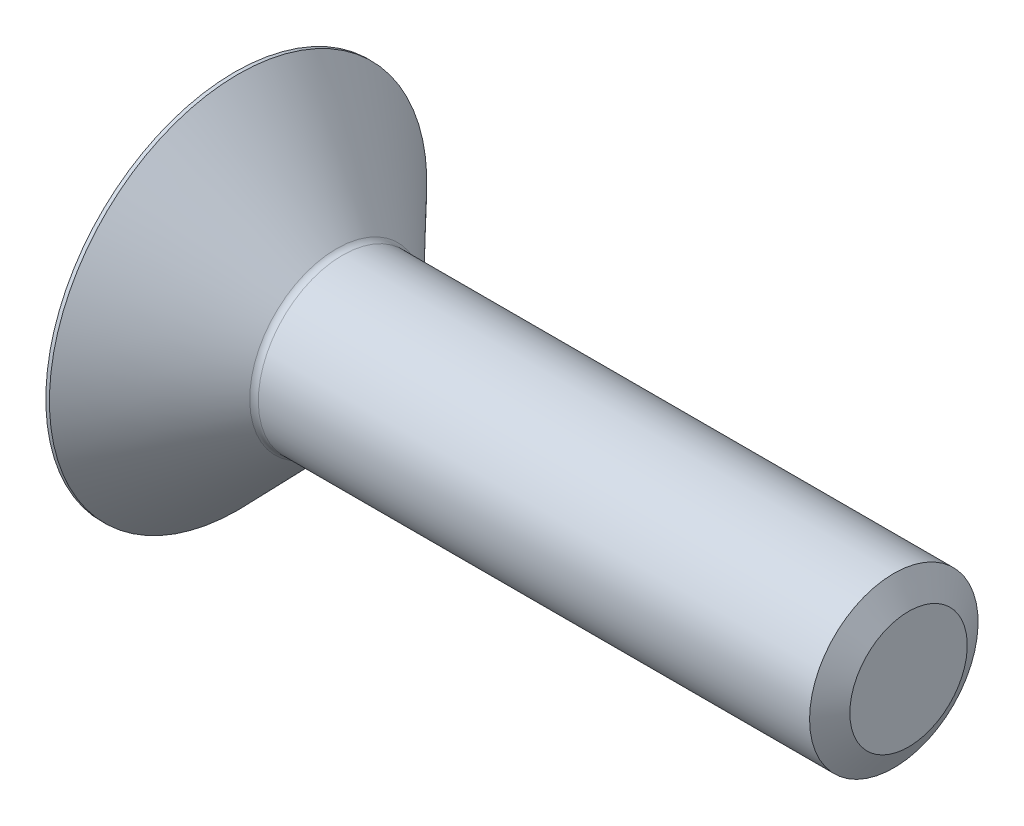
ISO-10303-21;
HEADER;
FILE_DESCRIPTION(('STEP AP214'),'2;1');
FILE_NAME('part.step','',(''),(''),'','','');
FILE_SCHEMA(('AUTOMOTIVE_DESIGN { 1 0 10303 214 1 1 1 1 }'));
ENDSEC;
DATA;
#1=APPLICATION_CONTEXT('core data for automotive mechanical design processes');
#2=APPLICATION_PROTOCOL_DEFINITION('international standard','automotive_design',2000,#1);
#3=PRODUCT_CONTEXT('',#1,'mechanical');
#4=PRODUCT('Part','Part','',(#3));
#5=PRODUCT_RELATED_PRODUCT_CATEGORY('part','',(#4));
#6=PRODUCT_DEFINITION_FORMATION('','',#4);
#7=PRODUCT_DEFINITION_CONTEXT('part definition',#1,'design');
#8=PRODUCT_DEFINITION('design','',#6,#7);
#9=PRODUCT_DEFINITION_SHAPE('','',#8);
#10=(LENGTH_UNIT() NAMED_UNIT(*) SI_UNIT(.MILLI.,.METRE.));
#11=(NAMED_UNIT(*) PLANE_ANGLE_UNIT() SI_UNIT($,.RADIAN.));
#12=(NAMED_UNIT(*) SI_UNIT($,.STERADIAN.) SOLID_ANGLE_UNIT());
#13=UNCERTAINTY_MEASURE_WITH_UNIT(LENGTH_MEASURE(1.E-05),#10,'distance_accuracy_value','');
#14=(GEOMETRIC_REPRESENTATION_CONTEXT(3) GLOBAL_UNCERTAINTY_ASSIGNED_CONTEXT((#13)) GLOBAL_UNIT_ASSIGNED_CONTEXT((#10,
#11,#12)) REPRESENTATION_CONTEXT('',''));
#15=CARTESIAN_POINT('',(0.,0.,0.));
#16=DIRECTION('',(0.,0.,1.));
#17=DIRECTION('',(1.,0.,0.));
#18=AXIS2_PLACEMENT_3D('',#15,#16,#17);
#19=CARTESIAN_POINT('',(0.,0.,0.));
#20=DIRECTION('',(1.,0.,0.));
#21=DIRECTION('',(0.,1.,0.));
#22=AXIS2_PLACEMENT_3D('',#19,#20,#21);
#23=CYLINDRICAL_SURFACE('',#22,2.);
#24=CARTESIAN_POINT('',(-13.4351050367581,0.,0.));
#25=DIRECTION('',(1.,0.,0.));
#26=DIRECTION('',(0.,1.,0.));
#27=AXIS2_PLACEMENT_3D('',#24,#25,#26);
#28=CIRCLE('',#27,2.);
#29=CARTESIAN_POINT('',(-13.4351050367581,2.,0.));
#30=VERTEX_POINT('',#29);
#31=EDGE_CURVE('E127',#30,#30,#28,.T.);
#32=ORIENTED_EDGE('',*,*,#31,.T.);
#33=EDGE_LOOP('',(#32));
#34=FACE_BOUND('',#33,.T.);
#35=CARTESIAN_POINT('',(-0.349999999999999,0.,0.));
#36=DIRECTION('',(-1.,0.,0.));
#37=DIRECTION('',(0.,0.,1.));
#38=AXIS2_PLACEMENT_3D('',#35,#36,#37);
#39=CIRCLE('',#38,2.);
#40=CARTESIAN_POINT('',(-0.349999999999999,0.,2.));
#41=VERTEX_POINT('',#40);
#42=EDGE_CURVE('E314',#41,#41,#39,.T.);
#43=ORIENTED_EDGE('',*,*,#42,.T.);
#44=EDGE_LOOP('',(#43));
#45=FACE_BOUND('',#44,.T.);
#46=ADVANCED_FACE('F40',(#34,#45),#23,.T.);
#47=CARTESIAN_POINT('',(-16.,4.48,0.));
#48=DIRECTION('',(-1.,0.,0.));
#49=DIRECTION('',(0.,-1.,0.));
#50=AXIS2_PLACEMENT_3D('',#47,#48,#49);
#51=PLANE('',#50);
#52=CARTESIAN_POINT('',(-16.,0.,0.));
#53=DIRECTION('',(1.,0.,0.));
#54=DIRECTION('',(0.,1.,0.));
#55=AXIS2_PLACEMENT_3D('',#52,#53,#54);
#56=CIRCLE('',#55,4.48);
#57=CARTESIAN_POINT('',(-16.,4.48,0.));
#58=VERTEX_POINT('',#57);
#59=EDGE_CURVE('E216',#58,#58,#56,.T.);
#60=ORIENTED_EDGE('',*,*,#59,.F.);
#61=EDGE_LOOP('',(#60));
#62=FACE_BOUND('',#61,.T.);
#63=CARTESIAN_POINT('',(-16.,0.,0.));
#64=DIRECTION('',(-1.,0.,0.));
#65=DIRECTION('',(0.,-1.,0.));
#66=AXIS2_PLACEMENT_3D('',#63,#64,#65);
#67=CIRCLE('',#66,1.44337567297406);
#68=CARTESIAN_POINT('',(-16.,-0.72168783648704,1.24999999999999));
#69=VERTEX_POINT('',#68);
#70=CARTESIAN_POINT('',(-16.,-1.44337567297406,0.));
#71=VERTEX_POINT('',#70);
#72=EDGE_CURVE('E44',#69,#71,#67,.F.);
#73=ORIENTED_EDGE('',*,*,#72,.T.);
#74=CARTESIAN_POINT('',(-16.,-0.72168783648704,-1.24999999999999));
#75=VERTEX_POINT('',#74);
#76=EDGE_CURVE('E11',#71,#75,#67,.F.);
#77=ORIENTED_EDGE('',*,*,#76,.T.);
#78=CARTESIAN_POINT('',(-16.,0.72168783648703,-1.25));
#79=VERTEX_POINT('',#78);
#80=EDGE_CURVE('E49',#75,#79,#67,.F.);
#81=ORIENTED_EDGE('',*,*,#80,.T.);
#82=CARTESIAN_POINT('',(-16.,1.44337567297406,0.));
#83=VERTEX_POINT('',#82);
#84=EDGE_CURVE('E114',#79,#83,#67,.F.);
#85=ORIENTED_EDGE('',*,*,#84,.T.);
#86=CARTESIAN_POINT('',(-16.,0.,0.));
#87=DIRECTION('',(-1.,0.,0.));
#88=DIRECTION('',(0.,0.,1.));
#89=AXIS2_PLACEMENT_3D('',#86,#87,#88);
#90=CIRCLE('',#89,1.44337567297406);
#91=CARTESIAN_POINT('',(-16.,0.721687836487035,1.25));
#92=VERTEX_POINT('',#91);
#93=EDGE_CURVE('E99',#92,#83,#90,.T.);
#94=ORIENTED_EDGE('',*,*,#93,.F.);
#95=EDGE_CURVE('E108',#92,#69,#67,.F.);
#96=ORIENTED_EDGE('',*,*,#95,.T.);
#97=EDGE_LOOP('',(#73,#77,#81,#85,#94,#96));
#98=FACE_BOUND('',#97,.T.);
#99=ADVANCED_FACE('F115',(#62,#98),#51,.T.);
#100=CARTESIAN_POINT('',(0.,0.,0.));
#101=DIRECTION('',(1.,0.,0.));
#102=DIRECTION('',(0.,1.,0.));
#103=AXIS2_PLACEMENT_3D('',#100,#101,#102);
#104=CYLINDRICAL_SURFACE('',#103,4.48);
#105=ORIENTED_EDGE('',*,*,#59,.T.);
#106=EDGE_LOOP('',(#105));
#107=FACE_BOUND('',#106,.T.);
#108=CARTESIAN_POINT('',(-15.9149081615215,0.,0.));
#109=DIRECTION('',(1.,0.,0.));
#110=DIRECTION('',(0.,1.,0.));
#111=AXIS2_PLACEMENT_3D('',#108,#109,#110);
#112=CIRCLE('',#111,4.48);
#113=CARTESIAN_POINT('',(-15.9149081615215,4.48,0.));
#114=VERTEX_POINT('',#113);
#115=EDGE_CURVE('E218',#114,#114,#112,.T.);
#116=ORIENTED_EDGE('',*,*,#115,.F.);
#117=EDGE_LOOP('',(#116));
#118=FACE_BOUND('',#117,.T.);
#119=ADVANCED_FACE('F206',(#107,#118),#104,.T.);
#120=CARTESIAN_POINT('',(-13.5789729968258,0.,0.));
#121=DIRECTION('',(-1.,0.,0.));
#122=DIRECTION('',(0.,-1.,0.));
#123=AXIS2_PLACEMENT_3D('',#120,#121,#122);
#124=CONICAL_SURFACE('',#123,2.0610683259082,0.802851455917393);
#125=ORIENTED_EDGE('',*,*,#115,.T.);
#126=EDGE_LOOP('',(#125));
#127=FACE_BOUND('',#126,.T.);
#128=CARTESIAN_POINT('',(-13.5789729968258,0.,0.));
#129=DIRECTION('',(1.,0.,0.));
#130=DIRECTION('',(0.,1.,0.));
#131=AXIS2_PLACEMENT_3D('',#128,#129,#130);
#132=CIRCLE('',#131,2.0610683259082);
#133=CARTESIAN_POINT('',(-13.5789729968258,2.0610683259082,0.));
#134=VERTEX_POINT('',#133);
#135=EDGE_CURVE('E222',#134,#134,#132,.T.);
#136=ORIENTED_EDGE('',*,*,#135,.F.);
#137=EDGE_LOOP('',(#136));
#138=FACE_BOUND('',#137,.T.);
#139=ADVANCED_FACE('F202',(#127,#138),#124,.T.);
#140=CARTESIAN_POINT('',(-13.4351050367581,0.,0.));
#141=DIRECTION('',(1.,0.,0.));
#142=DIRECTION('',(0.,1.,0.));
#143=AXIS2_PLACEMENT_3D('',#140,#141,#142);
#144=TOROIDAL_SURFACE('',#143,2.2,0.200000000000001);
#145=ORIENTED_EDGE('',*,*,#135,.T.);
#146=EDGE_LOOP('',(#145));
#147=FACE_BOUND('',#146,.T.);
#148=ORIENTED_EDGE('',*,*,#31,.F.);
#149=EDGE_LOOP('',(#148));
#150=FACE_BOUND('',#149,.T.);
#151=ADVANCED_FACE('F198',(#147,#150),#144,.F.);
#152=CARTESIAN_POINT('',(-15.593,0.,0.));
#153=DIRECTION('',(-1.,0.,0.));
#154=DIRECTION('',(0.,0.,1.));
#155=AXIS2_PLACEMENT_3D('',#152,#153,#154);
#156=CONICAL_SURFACE('',#155,0.,1.29595448752628);
#157=CARTESIAN_POINT('',(-16.0000325639069,-0.721572366433197,1.2502));
#158=CARTESIAN_POINT('',(-15.991576864719,-0.751541131585369,1.19829257611634));
#159=CARTESIAN_POINT('',(-15.9838983725877,-0.781569978777702,1.1462810870865));
#160=CARTESIAN_POINT('',(-15.9704054515754,-0.841745134078228,1.04205466075264));
#161=CARTESIAN_POINT('',(-15.964591866691,-0.871891489137524,0.989839642126926));
#162=CARTESIAN_POINT('',(-15.9551735985119,-0.932099362057424,0.885556547214008));
#163=CARTESIAN_POINT('',(-15.9515564854096,-0.962160380653127,0.833489335678977));
#164=CARTESIAN_POINT('',(-15.9467061131036,-1.02232485811963,0.729281403896156));
#165=CARTESIAN_POINT('',(-15.9454723393403,-1.05242830642509,0.677140701948078));
#166=CARTESIAN_POINT('',(-15.9454723393403,-1.11263520303601,0.572859298051922));
#167=CARTESIAN_POINT('',(-15.9467061131036,-1.14273865134147,0.520718596103843));
#168=CARTESIAN_POINT('',(-15.9515564854096,-1.20290312880797,0.416510664321023));
#169=CARTESIAN_POINT('',(-15.9551735985119,-1.23296414740368,0.364443452785991));
#170=CARTESIAN_POINT('',(-15.964591866691,-1.29317202032358,0.260160357873074));
#171=CARTESIAN_POINT('',(-15.9704054515754,-1.32331837538287,0.207945339247364));
#172=CARTESIAN_POINT('',(-15.9838983725877,-1.3834935306834,0.103718912913505));
#173=CARTESIAN_POINT('',(-15.991576864719,-1.41352237787573,0.0517074238836614));
#174=CARTESIAN_POINT('',(-16.0000325639069,-1.4434911430279,-0.000199999999999701));
#175=B_SPLINE_CURVE_WITH_KNOTS('',3,(#157,#158,#159,#160,#161,#162,#163,#164,#165,#166,#167,
#168,#169,#170,#171,#172,#173,#174),.UNSPECIFIED.,.F.,.F.,(4,2,2,2,2,2,2,2,4),(0.,
0.18160374958483,0.36328957156208,0.543937414070992,0.72454625060746,0.905155087143927,
1.08580292965284,1.26748875163009,1.44909250121492),.UNSPECIFIED.);
#176=EDGE_CURVE('E133',#69,#71,#175,.T.);
#177=ORIENTED_EDGE('',*,*,#176,.T.);
#178=ORIENTED_EDGE('',*,*,#72,.F.);
#179=EDGE_LOOP('',(#177,#178));
#180=FACE_BOUND('',#179,.T.);
#181=ADVANCED_FACE('F201',(#180),#156,.F.);
#182=CARTESIAN_POINT('',(-16.230054854727,-1.88192774876372,1.25));
#183=CARTESIAN_POINT('',(-16.2168061816408,-1.8255137400607,1.25));
#184=CARTESIAN_POINT('',(-16.2037258112081,-1.76906017891574,1.25));
#185=CARTESIAN_POINT('',(-16.1779869751788,-1.65605409957583,1.25));
#186=CARTESIAN_POINT('',(-16.1653285307257,-1.59950157657073,1.25));
#187=CARTESIAN_POINT('',(-16.1280879422272,-1.42954612490577,1.25));
#188=CARTESIAN_POINT('',(-16.1042709227473,-1.31597293305458,1.25));
#189=CARTESIAN_POINT('',(-16.0599692539508,-1.08931538105831,1.25));
#190=CARTESIAN_POINT('',(-16.0394543826368,-0.976237048644354,1.25));
#191=CARTESIAN_POINT('',(-16.0031083621366,-0.749332532153091,1.25));
#192=CARTESIAN_POINT('',(-15.9872761488083,-0.635506524005941,1.25));
#193=CARTESIAN_POINT('',(-15.9623551261036,-0.405617067524412,1.25));
#194=CARTESIAN_POINT('',(-15.9533532269162,-0.289543448802649,1.25));
#195=CARTESIAN_POINT('',(-15.9465899221525,-0.115205222838837,1.25));
#196=CARTESIAN_POINT('',(-15.9454583626773,-0.0570644643245798,1.25));
#197=CARTESIAN_POINT('',(-15.9454865772141,0.0592166170352015,1.25));
#198=CARTESIAN_POINT('',(-15.9466463560642,0.117356939879547,1.25));
#199=CARTESIAN_POINT('',(-15.9535104843876,0.292169226773828,1.25));
#200=CARTESIAN_POINT('',(-15.9626193191916,0.408714396179601,1.25));
#201=CARTESIAN_POINT('',(-15.987953181016,0.64106205157089,1.25));
#202=CARTESIAN_POINT('',(-16.0041839479739,0.756863861904299,1.25));
#203=CARTESIAN_POINT('',(-16.0420513932587,0.991534965339215,1.25));
#204=CARTESIAN_POINT('',(-16.063850897622,1.11037712244683,1.25));
#205=CARTESIAN_POINT('',(-16.1107131319875,1.34742332227276,1.25));
#206=CARTESIAN_POINT('',(-16.1357764440616,1.46562724724241,1.25));
#207=CARTESIAN_POINT('',(-16.1880082919745,1.70160185265613,1.25));
#208=CARTESIAN_POINT('',(-16.2151774684754,1.81937238974697,1.25));
#209=CARTESIAN_POINT('',(-16.2709069397528,2.05458449010658,1.25));
#210=CARTESIAN_POINT('',(-16.2994672676032,2.17202604548372,1.25));
#211=CARTESIAN_POINT('',(-16.3571404984079,2.40505512634129,1.25));
#212=CARTESIAN_POINT('',(-16.3862403573857,2.52064589314675,1.25));
#213=CARTESIAN_POINT('',(-16.4451006119577,2.7516618269686,1.25));
#214=CARTESIAN_POINT('',(-16.4748610242592,2.86708698971762,1.25));
#215=CARTESIAN_POINT('',(-16.534817355156,3.09763737586545,1.25));
#216=CARTESIAN_POINT('',(-16.5650125463553,3.21276278881204,1.25));
#217=CARTESIAN_POINT('',(-16.6257689948511,3.44291215791421,1.25));
#218=CARTESIAN_POINT('',(-16.656330237577,3.55793611791373,1.25));
#219=CARTESIAN_POINT('',(-16.687019012393,3.67292565898518,1.25));
#220=B_SPLINE_CURVE_WITH_KNOTS('',3,(#182,#183,#184,#185,#186,#187,#188,#189,#190,#191,#192,
#193,#194,#195,#196,#197,#198,#199,#200,#201,#202,#203,#204,#205,#206,#207,#208,#209,#210,#211,
#212,#213,#214,#215,#216,#217,#218,#219),.UNSPECIFIED.,.F.,.F.,(4,2,2,2,2,2,2,2,2,2,2,2,2,2,2,2,
2,2,4),(0.,0.173845962501761,0.347700623700958,0.695803457931749,1.04051283645618,
1.38514381887278,1.73408963262349,1.90850297063879,2.08291667692807,2.43329501130733,
2.78395625407464,3.14636001893445,3.50882850410612,3.87140769831936,4.2339955168655,
4.59158519290897,4.94918392371833,5.30624137064038,5.66328465178794),.UNSPECIFIED.);
#221=EDGE_CURVE('E104',#92,#69,#220,.F.);
#222=ORIENTED_EDGE('',*,*,#221,.T.);
#223=ORIENTED_EDGE('',*,*,#95,.F.);
#224=EDGE_LOOP('',(#222,#223));
#225=FACE_BOUND('',#224,.T.);
#226=ADVANCED_FACE('F109',(#225),#156,.F.);
#227=CARTESIAN_POINT('',(-16.0000325639069,1.4434911430279,-0.000200000000000113));
#228=CARTESIAN_POINT('',(-15.991576864719,1.41352237787573,0.0517074238836605));
#229=CARTESIAN_POINT('',(-15.9838983725877,1.3834935306834,0.103718912913504));
#230=CARTESIAN_POINT('',(-15.9704054515754,1.32331837538287,0.207945339247363));
#231=CARTESIAN_POINT('',(-15.964591866691,1.29317202032357,0.260160357873074));
#232=CARTESIAN_POINT('',(-15.9551735985119,1.23296414740367,0.364443452785991));
#233=CARTESIAN_POINT('',(-15.9515564854096,1.20290312880797,0.416510664321023));
#234=CARTESIAN_POINT('',(-15.9467061131036,1.14273865134146,0.520718596103843));
#235=CARTESIAN_POINT('',(-15.9454723393403,1.11263520303601,0.572859298051922));
#236=CARTESIAN_POINT('',(-15.9454723393403,1.05242830642509,0.677140701948078));
#237=CARTESIAN_POINT('',(-15.9467061131036,1.02232485811963,0.729281403896156));
#238=CARTESIAN_POINT('',(-15.9515564854096,0.962160380653123,0.833489335678976));
#239=CARTESIAN_POINT('',(-15.9551735985119,0.932099362057419,0.885556547214008));
#240=CARTESIAN_POINT('',(-15.964591866691,0.871891489137519,0.989839642126926));
#241=CARTESIAN_POINT('',(-15.9704054515754,0.841745134078223,1.04205466075264));
#242=CARTESIAN_POINT('',(-15.9838983725877,0.781569978777697,1.1462810870865));
#243=CARTESIAN_POINT('',(-15.991576864719,0.751541131585364,1.19829257611634));
#244=CARTESIAN_POINT('',(-16.0000325639069,0.721572366433193,1.2502));
#245=B_SPLINE_CURVE_WITH_KNOTS('',3,(#227,#228,#229,#230,#231,#232,#233,#234,#235,#236,#237,
#238,#239,#240,#241,#242,#243,#244),.UNSPECIFIED.,.F.,.F.,(4,2,2,2,2,2,2,2,4),(0.,
0.18160374958483,0.36328957156208,0.543937414070993,0.72454625060746,0.905155087143927,
1.08580292965284,1.26748875163009,1.44909250121492),.UNSPECIFIED.);
#246=EDGE_CURVE('E95',#83,#92,#245,.T.);
#247=ORIENTED_EDGE('',*,*,#246,.T.);
#248=ORIENTED_EDGE('',*,*,#93,.T.);
#249=EDGE_LOOP('',(#247,#248));
#250=FACE_BOUND('',#249,.T.);
#251=ADVANCED_FACE('F97',(#250),#156,.F.);
#252=CARTESIAN_POINT('',(-16.0000325639069,0.721572366433192,-1.2502));
#253=CARTESIAN_POINT('',(-15.991576864719,0.751541131585364,-1.19829257611634));
#254=CARTESIAN_POINT('',(-15.9838983725877,0.781569978777697,-1.1462810870865));
#255=CARTESIAN_POINT('',(-15.9704054515754,0.841745134078223,-1.04205466075264));
#256=CARTESIAN_POINT('',(-15.964591866691,0.871891489137519,-0.989839642126926));
#257=CARTESIAN_POINT('',(-15.9551735985119,0.932099362057419,-0.885556547214009));
#258=CARTESIAN_POINT('',(-15.9515564854096,0.962160380653123,-0.833489335678977));
#259=CARTESIAN_POINT('',(-15.9467061131036,1.02232485811963,-0.729281403896157));
#260=CARTESIAN_POINT('',(-15.9454723393403,1.05242830642509,-0.677140701948078));
#261=CARTESIAN_POINT('',(-15.9454723393403,1.11263520303601,-0.572859298051922));
#262=CARTESIAN_POINT('',(-15.9467061131036,1.14273865134146,-0.520718596103844));
#263=CARTESIAN_POINT('',(-15.9515564854096,1.20290312880797,-0.416510664321023));
#264=CARTESIAN_POINT('',(-15.9551735985119,1.23296414740367,-0.364443452785991));
#265=CARTESIAN_POINT('',(-15.964591866691,1.29317202032357,-0.260160357873074));
#266=CARTESIAN_POINT('',(-15.9704054515754,1.32331837538287,-0.207945339247364));
#267=CARTESIAN_POINT('',(-15.9838983725877,1.3834935306834,-0.103718912913505));
#268=CARTESIAN_POINT('',(-15.991576864719,1.41352237787573,-0.0517074238836612));
#269=CARTESIAN_POINT('',(-16.0000325639069,1.4434911430279,0.000199999999999882));
#270=B_SPLINE_CURVE_WITH_KNOTS('',3,(#252,#253,#254,#255,#256,#257,#258,#259,#260,#261,#262,
#263,#264,#265,#266,#267,#268,#269),.UNSPECIFIED.,.F.,.F.,(4,2,2,2,2,2,2,2,4),(0.,
0.18160374958483,0.36328957156208,0.543937414070993,0.72454625060746,0.905155087143928,
1.08580292965284,1.26748875163009,1.44909250121492),.UNSPECIFIED.);
#271=EDGE_CURVE('E117',#79,#83,#270,.T.);
#272=ORIENTED_EDGE('',*,*,#271,.T.);
#273=ORIENTED_EDGE('',*,*,#84,.F.);
#274=EDGE_LOOP('',(#272,#273));
#275=FACE_BOUND('',#274,.T.);
#276=ADVANCED_FACE('F297',(#275),#156,.F.);
#277=CARTESIAN_POINT('',(-16.230054854727,-1.88192774876372,-1.25));
#278=CARTESIAN_POINT('',(-16.2168061816408,-1.8255137400607,-1.25));
#279=CARTESIAN_POINT('',(-16.2037258112081,-1.76906017891574,-1.25));
#280=CARTESIAN_POINT('',(-16.1779869751788,-1.65605409957583,-1.25));
#281=CARTESIAN_POINT('',(-16.1653285307257,-1.59950157657073,-1.25));
#282=CARTESIAN_POINT('',(-16.1280879422272,-1.42954612490577,-1.25));
#283=CARTESIAN_POINT('',(-16.1042709227473,-1.31597293305458,-1.25));
#284=CARTESIAN_POINT('',(-16.0599692539508,-1.08931538105831,-1.25));
#285=CARTESIAN_POINT('',(-16.0394543826368,-0.976237048644354,-1.25));
#286=CARTESIAN_POINT('',(-16.0031083621366,-0.74933253215309,-1.25));
#287=CARTESIAN_POINT('',(-15.9872761488083,-0.635506524005941,-1.25));
#288=CARTESIAN_POINT('',(-15.9623551261036,-0.405617067524411,-1.25));
#289=CARTESIAN_POINT('',(-15.9533532269162,-0.289543448802648,-1.25));
#290=CARTESIAN_POINT('',(-15.9465899221525,-0.115205222838836,-1.25));
#291=CARTESIAN_POINT('',(-15.9454583626773,-0.0570644643245787,-1.25));
#292=CARTESIAN_POINT('',(-15.9454865772141,0.0592166170352027,-1.25));
#293=CARTESIAN_POINT('',(-15.9466463560642,0.117356939879548,-1.25));
#294=CARTESIAN_POINT('',(-15.9535104843876,0.292169226773829,-1.25));
#295=CARTESIAN_POINT('',(-15.9626193191916,0.408714396179602,-1.25));
#296=CARTESIAN_POINT('',(-15.987953181016,0.641062051570891,-1.25));
#297=CARTESIAN_POINT('',(-16.0041839479739,0.7568638619043,-1.25));
#298=CARTESIAN_POINT('',(-16.0420513932587,0.991534965339216,-1.25));
#299=CARTESIAN_POINT('',(-16.063850897622,1.11037712244683,-1.25));
#300=CARTESIAN_POINT('',(-16.1107131319875,1.34742332227276,-1.25));
#301=CARTESIAN_POINT('',(-16.1357764440616,1.46562724724241,-1.25));
#302=CARTESIAN_POINT('',(-16.1880082919745,1.70160185265613,-1.25));
#303=CARTESIAN_POINT('',(-16.2151774684754,1.81937238974697,-1.25));
#304=CARTESIAN_POINT('',(-16.2709069397528,2.05458449010658,-1.25));
#305=CARTESIAN_POINT('',(-16.2994672676032,2.17202604548372,-1.25));
#306=CARTESIAN_POINT('',(-16.3571404984079,2.40505512634129,-1.25));
#307=CARTESIAN_POINT('',(-16.3862403573857,2.52064589314675,-1.25));
#308=CARTESIAN_POINT('',(-16.4451006119577,2.7516618269686,-1.25));
#309=CARTESIAN_POINT('',(-16.4748610242592,2.86708698971762,-1.25));
#310=CARTESIAN_POINT('',(-16.534817355156,3.09763737586545,-1.25));
#311=CARTESIAN_POINT('',(-16.5650125463553,3.21276278881204,-1.25));
#312=CARTESIAN_POINT('',(-16.6257689948511,3.44291215791421,-1.25));
#313=CARTESIAN_POINT('',(-16.656330237577,3.55793611791373,-1.25));
#314=CARTESIAN_POINT('',(-16.687019012393,3.67292565898518,-1.25));
#315=B_SPLINE_CURVE_WITH_KNOTS('',3,(#277,#278,#279,#280,#281,#282,#283,#284,#285,#286,#287,
#288,#289,#290,#291,#292,#293,#294,#295,#296,#297,#298,#299,#300,#301,#302,#303,#304,#305,#306,
#307,#308,#309,#310,#311,#312,#313,#314),.UNSPECIFIED.,.F.,.F.,(4,2,2,2,2,2,2,2,2,2,2,2,2,2,2,2,
2,2,4),(0.,0.17384596250176,0.347700623700958,0.695803457931749,1.04051283645618,
1.38514381887278,1.73408963262349,1.90850297063879,2.08291667692807,2.43329501130733,
2.78395625407464,3.14636001893446,3.50882850410612,3.87140769831936,4.2339955168655,
4.59158519290896,4.94918392371833,5.30624137064038,5.66328465178794),.UNSPECIFIED.);
#316=EDGE_CURVE('E252',#75,#79,#315,.T.);
#317=ORIENTED_EDGE('',*,*,#316,.T.);
#318=ORIENTED_EDGE('',*,*,#80,.F.);
#319=EDGE_LOOP('',(#317,#318));
#320=FACE_BOUND('',#319,.T.);
#321=ADVANCED_FACE('F284',(#320),#156,.F.);
#322=CARTESIAN_POINT('',(-16.0000325639069,-1.4434911430279,0.000199999999999665));
#323=CARTESIAN_POINT('',(-15.991576864719,-1.41352237787573,-0.0517074238836611));
#324=CARTESIAN_POINT('',(-15.9838983725877,-1.3834935306834,-0.103718912913504));
#325=CARTESIAN_POINT('',(-15.9704054515754,-1.32331837538287,-0.207945339247363));
#326=CARTESIAN_POINT('',(-15.964591866691,-1.29317202032358,-0.260160357873074));
#327=CARTESIAN_POINT('',(-15.9551735985119,-1.23296414740368,-0.364443452785991));
#328=CARTESIAN_POINT('',(-15.9515564854096,-1.20290312880797,-0.416510664321023));
#329=CARTESIAN_POINT('',(-15.9467061131036,-1.14273865134147,-0.520718596103844));
#330=CARTESIAN_POINT('',(-15.9454723393403,-1.11263520303601,-0.572859298051922));
#331=CARTESIAN_POINT('',(-15.9454723393403,-1.05242830642509,-0.677140701948078));
#332=CARTESIAN_POINT('',(-15.9467061131036,-1.02232485811963,-0.729281403896157));
#333=CARTESIAN_POINT('',(-15.9515564854096,-0.962160380653126,-0.833489335678977));
#334=CARTESIAN_POINT('',(-15.9551735985119,-0.932099362057423,-0.885556547214009));
#335=CARTESIAN_POINT('',(-15.964591866691,-0.871891489137523,-0.989839642126926));
#336=CARTESIAN_POINT('',(-15.9704054515754,-0.841745134078227,-1.04205466075264));
#337=CARTESIAN_POINT('',(-15.9838983725877,-0.781569978777701,-1.1462810870865));
#338=CARTESIAN_POINT('',(-15.991576864719,-0.751541131585368,-1.19829257611634));
#339=CARTESIAN_POINT('',(-16.0000325639069,-0.721572366433196,-1.2502));
#340=B_SPLINE_CURVE_WITH_KNOTS('',3,(#322,#323,#324,#325,#326,#327,#328,#329,#330,#331,#332,
#333,#334,#335,#336,#337,#338,#339),.UNSPECIFIED.,.F.,.F.,(4,2,2,2,2,2,2,2,4),(0.,
0.18160374958483,0.363289571562081,0.543937414070993,0.72454625060746,0.905155087143928,
1.08580292965284,1.26748875163009,1.44909250121492),.UNSPECIFIED.);
#341=EDGE_CURVE('E135',#71,#75,#340,.T.);
#342=ORIENTED_EDGE('',*,*,#341,.T.);
#343=ORIENTED_EDGE('',*,*,#76,.F.);
#344=EDGE_LOOP('',(#342,#343));
#345=FACE_BOUND('',#344,.T.);
#346=ADVANCED_FACE('F287',(#345),#156,.F.);
#347=CARTESIAN_POINT('',(-14.5,0.,0.));
#348=DIRECTION('',(-1.,0.,0.));
#349=DIRECTION('',(0.,0.,1.));
#350=AXIS2_PLACEMENT_3D('',#347,#348,#349);
#351=CONICAL_SURFACE('',#350,1.44337567297406,1.0471975511966);
#352=CARTESIAN_POINT('',(-13.6666666666667,0.,0.));
#353=VERTEX_POINT('',#352);
#354=VERTEX_LOOP('',#353);
#355=FACE_BOUND('',#354,.T.);
#356=CARTESIAN_POINT('',(-14.9647941109243,-1.86893140179217,1.25));
#357=CARTESIAN_POINT('',(-14.9388968384665,-1.81495202267025,1.25));
#358=CARTESIAN_POINT('',(-14.9132686219312,-1.76084125344196,1.25));
#359=CARTESIAN_POINT('',(-14.8627027606134,-1.65228662652066,1.25));
#360=CARTESIAN_POINT('',(-14.8377652401103,-1.59784271100767,1.25));
#361=CARTESIAN_POINT('',(-14.7885939163498,-1.48823931692675,1.25));
#362=CARTESIAN_POINT('',(-14.7643652994868,-1.43307750108907,1.25));
#363=CARTESIAN_POINT('',(-14.7169950705039,-1.3222918844362,1.25));
#364=CARTESIAN_POINT('',(-14.6938534018645,-1.26666810781962,1.25));
#365=CARTESIAN_POINT('',(-14.6483546130678,-1.15340083047608,1.25));
#366=CARTESIAN_POINT('',(-14.6260338154653,-1.09574254265115,1.25));
#367=CARTESIAN_POINT('',(-14.583255476912,-0.979741082890173,1.25));
#368=CARTESIAN_POINT('',(-14.5627981694397,-0.921397826164637,1.25));
#369=CARTESIAN_POINT('',(-14.5050842376762,-0.745435524772239,1.25));
#370=CARTESIAN_POINT('',(-14.4713502149769,-0.626561938132859,1.25));
#371=CARTESIAN_POINT('',(-14.4322204068282,-0.445873083681238,1.25));
#372=CARTESIAN_POINT('',(-14.4210940606188,-0.385304700192767,1.25));
#373=CARTESIAN_POINT('',(-14.4034278522676,-0.26348659206503,1.25));
#374=CARTESIAN_POINT('',(-14.3968876801832,-0.202236913753246,1.25));
#375=CARTESIAN_POINT('',(-14.3889987810428,-0.0801324468775838,1.25));
#376=CARTESIAN_POINT('',(-14.3875887912582,-0.0192817197887155,1.25));
#377=CARTESIAN_POINT('',(-14.3899161878862,0.102319232701153,1.25));
#378=CARTESIAN_POINT('',(-14.393653893026,0.163069451645861,1.25));
#379=CARTESIAN_POINT('',(-14.4088980280361,0.312961598922925,1.25));
#380=CARTESIAN_POINT('',(-14.4232612484297,0.40181305562826,1.25));
#381=CARTESIAN_POINT('',(-14.4602998495149,0.577788146583197,1.25));
#382=CARTESIAN_POINT('',(-14.4829852483541,0.664909564430747,1.25));
#383=CARTESIAN_POINT('',(-14.5217374532821,0.795209224728789,1.25));
#384=CARTESIAN_POINT('',(-14.5356229448103,0.839061001813531,1.25));
#385=CARTESIAN_POINT('',(-14.5646784153621,0.926308087473951,1.25));
#386=CARTESIAN_POINT('',(-14.5798475927664,0.969703662172457,1.25));
#387=CARTESIAN_POINT('',(-14.6112501339966,1.05609633508793,1.25));
#388=CARTESIAN_POINT('',(-14.627483304423,1.09909350410933,1.25));
#389=CARTESIAN_POINT('',(-14.6608382439108,1.18474903910479,1.25));
#390=CARTESIAN_POINT('',(-14.6779601631043,1.22740734642399,1.25));
#391=CARTESIAN_POINT('',(-14.7227614292321,1.33629459550825,1.25));
#392=CARTESIAN_POINT('',(-14.7509693835735,1.40230581092028,1.25));
#393=CARTESIAN_POINT('',(-14.8087450811585,1.53373213594212,1.25));
#394=CARTESIAN_POINT('',(-14.8383129262699,1.59914720045374,1.25));
#395=CARTESIAN_POINT('',(-14.9285769200244,1.79469680395942,1.25));
#396=CARTESIAN_POINT('',(-14.9908242731852,1.92411390982368,1.25));
#397=CARTESIAN_POINT('',(-15.1179296229027,2.18184246876936,1.25));
#398=CARTESIAN_POINT('',(-15.182790734765,2.31015236703661,1.25));
#399=CARTESIAN_POINT('',(-15.3141807455314,2.56589305685455,1.25));
#400=CARTESIAN_POINT('',(-15.3807094324427,2.69332395754888,1.25));
#401=CARTESIAN_POINT('',(-15.5085820016458,2.93557826301821,1.25));
#402=CARTESIAN_POINT('',(-15.5698225704122,3.05045639113075,1.25));
#403=CARTESIAN_POINT('',(-15.6930014800409,3.27984311898855,1.25));
#404=CARTESIAN_POINT('',(-15.7549398467262,3.39435170485538,1.25));
#405=CARTESIAN_POINT('',(-15.8791811560561,3.62279327872168,1.25));
#406=CARTESIAN_POINT('',(-15.941482770676,3.73672698995313,1.25));
#407=CARTESIAN_POINT('',(-16.0664914919315,3.96436406629494,1.25));
#408=CARTESIAN_POINT('',(-16.1291985771761,4.07806744314787,1.25));
#409=CARTESIAN_POINT('',(-16.1920543493623,4.19168806612954,1.25));
#410=B_SPLINE_CURVE_WITH_KNOTS('',3,(#356,#357,#358,#359,#360,#361,#362,#363,#364,#365,#366,
#367,#368,#369,#370,#371,#372,#373,#374,#375,#376,#377,#378,#379,#380,#381,#382,#383,#384,#385,
#386,#387,#388,#389,#390,#391,#392,#393,#394,#395,#396,#397,#398,#399,#400,#401,#402,#403,#404,
#405,#406,#407,#408,#409),.UNSPECIFIED.,.F.,.F.,(4,2,2,2,2,2,2,2,2,2,2,2,2,2,2,2,2,2,2,2,2,2,2,
2,2,2,4),(0.,0.179612926712516,0.359257964580627,0.539992735616911,0.720718098311215,
0.906167781883879,1.09164066876279,1.4615401462125,1.64614554413147,1.83073846485713,
2.01311967401941,2.19551217609307,2.46497297688035,2.73475922178117,2.87273702323329,
3.01062928909397,3.14849655975686,3.28638719597089,3.50172172546908,3.7170724117864,
4.14784491349865,4.57914698286382,5.01039449766869,5.40093821140478,5.79149642546539,
6.18106124184771,6.57060567131893),.UNSPECIFIED.);
#411=CARTESIAN_POINT('',(-14.5,-0.721687836487035,1.25));
#412=VERTEX_POINT('',#411);
#413=CARTESIAN_POINT('',(-14.5,0.721687836487031,1.25));
#414=VERTEX_POINT('',#413);
#415=EDGE_CURVE('E167',#412,#414,#410,.T.);
#416=ORIENTED_EDGE('',*,*,#415,.T.);
#417=CARTESIAN_POINT('',(-14.500066674666,0.721572366433193,1.2502));
#418=CARTESIAN_POINT('',(-14.4817459147637,0.753288124996228,1.19526669476824));
#419=CARTESIAN_POINT('',(-14.4650833062006,0.785277649221701,1.13985921349976));
#420=CARTESIAN_POINT('',(-14.4359973039458,0.849810733708401,1.02808463239966));
#421=CARTESIAN_POINT('',(-14.4235842019761,0.88235544140118,0.97171554515829));
#422=CARTESIAN_POINT('',(-14.404259687636,0.947041487997315,0.859676025913016));
#423=CARTESIAN_POINT('',(-14.3972196894474,0.979172868975891,0.804022841540771));
#424=CARTESIAN_POINT('',(-14.3888124326306,1.04358696985655,0.692454346091609));
#425=CARTESIAN_POINT('',(-14.3874382152047,1.07586945532687,0.6365394410624));
#426=CARTESIAN_POINT('',(-14.3902833373679,1.13620103554812,0.532042078818275));
#427=CARTESIAN_POINT('',(-14.39380409882,1.16425912049992,0.483444050118685));
#428=CARTESIAN_POINT('',(-14.4049671126993,1.22019247526559,0.386564637826762));
#429=CARTESIAN_POINT('',(-14.4126131855727,1.24806755133607,0.338283589807837));
#430=CARTESIAN_POINT('',(-14.4317294547005,1.30411641158755,0.241204116145957));
#431=CARTESIAN_POINT('',(-14.4432807569797,1.3322830948538,0.192417989648101));
#432=CARTESIAN_POINT('',(-14.4694983146939,1.38819614400745,0.0955737477078981));
#433=CARTESIAN_POINT('',(-14.4841584021391,1.41594322730595,0.0475143896730358));
#434=CARTESIAN_POINT('',(-14.500066674666,1.4434911430279,-0.000199999999999986));
#435=B_SPLINE_CURVE_WITH_KNOTS('',3,(#417,#418,#419,#420,#421,#422,#423,#424,#425,#426,#427,
#428,#429,#430,#431,#432,#433,#434),.UNSPECIFIED.,.F.,.F.,(4,2,2,2,2,2,2,2,4),(0.,
0.198150821029559,0.396778196315221,0.5904886173544,0.783961049317181,0.952480056398646,
1.1211553973001,1.2935743034359,1.4656542697693),.UNSPECIFIED.);
#436=CARTESIAN_POINT('',(-14.5,1.44337567297406,0.));
#437=VERTEX_POINT('',#436);
#438=EDGE_CURVE('E124',#414,#437,#435,.T.);
#439=ORIENTED_EDGE('',*,*,#438,.T.);
#440=CARTESIAN_POINT('',(-14.500066674666,1.4434911430279,0.000199999999999734));
#441=CARTESIAN_POINT('',(-14.4817459147637,1.41177538446486,-0.0547333052317653));
#442=CARTESIAN_POINT('',(-14.4650833062006,1.37978586023939,-0.11014078650024));
#443=CARTESIAN_POINT('',(-14.4359973039458,1.31525277575269,-0.22191536760034));
#444=CARTESIAN_POINT('',(-14.4235842019761,1.28270806805991,-0.27828445484171));
#445=CARTESIAN_POINT('',(-14.404259687636,1.21802202146378,-0.390323974086984));
#446=CARTESIAN_POINT('',(-14.3972196894474,1.1858906404852,-0.445977158459229));
#447=CARTESIAN_POINT('',(-14.3888124326306,1.12147653960455,-0.557545653908391));
#448=CARTESIAN_POINT('',(-14.3874382152047,1.08919405413422,-0.613460558937599));
#449=CARTESIAN_POINT('',(-14.3902833373679,1.02886247391297,-0.717957921181724));
#450=CARTESIAN_POINT('',(-14.39380409882,1.00080438896118,-0.766555949881314));
#451=CARTESIAN_POINT('',(-14.4049671126993,0.944871034195502,-0.863435362173237));
#452=CARTESIAN_POINT('',(-14.4126131855727,0.916995958125019,-0.911716410192162));
#453=CARTESIAN_POINT('',(-14.4317294547005,0.860947097873545,-1.00879588385404));
#454=CARTESIAN_POINT('',(-14.4432807569797,0.832780414607289,-1.0575820103519));
#455=CARTESIAN_POINT('',(-14.4694983146939,0.776867365453647,-1.1544262522921));
#456=CARTESIAN_POINT('',(-14.4841584021391,0.749120282155139,-1.20248561032696));
#457=CARTESIAN_POINT('',(-14.500066674666,0.721572366433193,-1.2502));
#458=B_SPLINE_CURVE_WITH_KNOTS('',3,(#440,#441,#442,#443,#444,#445,#446,#447,#448,#449,#450,
#451,#452,#453,#454,#455,#456,#457),.UNSPECIFIED.,.F.,.F.,(4,2,2,2,2,2,2,2,4),(0.,
0.198150821029559,0.39677819631522,0.590488617354398,0.78396104931718,0.952480056398644,
1.1211553973001,1.2935743034359,1.4656542697693),.UNSPECIFIED.);
#459=CARTESIAN_POINT('',(-14.5,0.721687836487032,-1.25));
#460=VERTEX_POINT('',#459);
#461=EDGE_CURVE('E217',#437,#460,#458,.T.);
#462=ORIENTED_EDGE('',*,*,#461,.T.);
#463=CARTESIAN_POINT('',(-14.9647941109243,-1.86893140179217,-1.25));
#464=CARTESIAN_POINT('',(-14.9388968384665,-1.81495202267025,-1.25));
#465=CARTESIAN_POINT('',(-14.9132686219312,-1.76084125344196,-1.25));
#466=CARTESIAN_POINT('',(-14.8627027606134,-1.65228662652066,-1.25));
#467=CARTESIAN_POINT('',(-14.8377652401103,-1.59784271100767,-1.25));
#468=CARTESIAN_POINT('',(-14.7885939163498,-1.48823931692675,-1.25));
#469=CARTESIAN_POINT('',(-14.7643652994868,-1.43307750108907,-1.25));
#470=CARTESIAN_POINT('',(-14.7169950705039,-1.3222918844362,-1.25));
#471=CARTESIAN_POINT('',(-14.6938534018645,-1.26666810781962,-1.25));
#472=CARTESIAN_POINT('',(-14.6483546130678,-1.15340083047608,-1.25));
#473=CARTESIAN_POINT('',(-14.6260338154653,-1.09574254265115,-1.25));
#474=CARTESIAN_POINT('',(-14.583255476912,-0.979741082890172,-1.25));
#475=CARTESIAN_POINT('',(-14.5627981694397,-0.921397826164636,-1.25));
#476=CARTESIAN_POINT('',(-14.5050842376762,-0.745435524772239,-1.25));
#477=CARTESIAN_POINT('',(-14.4713502149769,-0.626561938132859,-1.25));
#478=CARTESIAN_POINT('',(-14.4322204068282,-0.445873083681238,-1.25));
#479=CARTESIAN_POINT('',(-14.4210940606188,-0.385304700192767,-1.25));
#480=CARTESIAN_POINT('',(-14.4034278522676,-0.263486592065029,-1.25));
#481=CARTESIAN_POINT('',(-14.3968876801832,-0.202236913753246,-1.25));
#482=CARTESIAN_POINT('',(-14.3889987810428,-0.0801324468775834,-1.25));
#483=CARTESIAN_POINT('',(-14.3875887912582,-0.019281719788715,-1.25));
#484=CARTESIAN_POINT('',(-14.3899161878862,0.102319232701154,-1.25));
#485=CARTESIAN_POINT('',(-14.393653893026,0.163069451645862,-1.25));
#486=CARTESIAN_POINT('',(-14.4088980280361,0.312961598922926,-1.25));
#487=CARTESIAN_POINT('',(-14.4232612484297,0.401813055628261,-1.25));
#488=CARTESIAN_POINT('',(-14.4602998495149,0.577788146583199,-1.25));
#489=CARTESIAN_POINT('',(-14.4829852483541,0.664909564430749,-1.25));
#490=CARTESIAN_POINT('',(-14.5217374532821,0.795209224728791,-1.25));
#491=CARTESIAN_POINT('',(-14.5356229448103,0.839061001813533,-1.25));
#492=CARTESIAN_POINT('',(-14.5646784153621,0.926308087473952,-1.25));
#493=CARTESIAN_POINT('',(-14.5798475927664,0.969703662172459,-1.25));
#494=CARTESIAN_POINT('',(-14.6112501339966,1.05609633508794,-1.25));
#495=CARTESIAN_POINT('',(-14.627483304423,1.09909350410933,-1.25));
#496=CARTESIAN_POINT('',(-14.6608382439108,1.18474903910479,-1.25));
#497=CARTESIAN_POINT('',(-14.6779601631043,1.22740734642399,-1.25));
#498=CARTESIAN_POINT('',(-14.7227614292321,1.33629459550825,-1.25));
#499=CARTESIAN_POINT('',(-14.7509693835735,1.40230581092028,-1.25));
#500=CARTESIAN_POINT('',(-14.8087450811585,1.53373213594212,-1.25));
#501=CARTESIAN_POINT('',(-14.8383129262699,1.59914720045374,-1.25));
#502=CARTESIAN_POINT('',(-14.9285769200244,1.79469680395942,-1.25));
#503=CARTESIAN_POINT('',(-14.9908242731852,1.92411390982368,-1.25));
#504=CARTESIAN_POINT('',(-15.1179296229027,2.18184246876936,-1.25));
#505=CARTESIAN_POINT('',(-15.182790734765,2.31015236703661,-1.25));
#506=CARTESIAN_POINT('',(-15.3141807455314,2.56589305685455,-1.25));
#507=CARTESIAN_POINT('',(-15.3807094324427,2.69332395754888,-1.25));
#508=CARTESIAN_POINT('',(-15.5085820016458,2.93557826301822,-1.25));
#509=CARTESIAN_POINT('',(-15.5698225704122,3.05045639113076,-1.25));
#510=CARTESIAN_POINT('',(-15.6930014800409,3.27984311898855,-1.25));
#511=CARTESIAN_POINT('',(-15.7549398467262,3.39435170485538,-1.25));
#512=CARTESIAN_POINT('',(-15.8791811560561,3.62279327872168,-1.25));
#513=CARTESIAN_POINT('',(-15.941482770676,3.73672698995313,-1.25));
#514=CARTESIAN_POINT('',(-16.0664914919315,3.96436406629495,-1.25));
#515=CARTESIAN_POINT('',(-16.1291985771761,4.07806744314788,-1.25));
#516=CARTESIAN_POINT('',(-16.1920543493623,4.19168806612954,-1.25));
#517=B_SPLINE_CURVE_WITH_KNOTS('',3,(#463,#464,#465,#466,#467,#468,#469,#470,#471,#472,#473,
#474,#475,#476,#477,#478,#479,#480,#481,#482,#483,#484,#485,#486,#487,#488,#489,#490,#491,#492,
#493,#494,#495,#496,#497,#498,#499,#500,#501,#502,#503,#504,#505,#506,#507,#508,#509,#510,#511,
#512,#513,#514,#515,#516),.UNSPECIFIED.,.F.,.F.,(4,2,2,2,2,2,2,2,2,2,2,2,2,2,2,2,2,2,2,2,2,2,2,
2,2,2,4),(0.,0.179612926712517,0.359257964580627,0.53999273561691,0.720718098311215,
0.906167781883879,1.09164066876279,1.4615401462125,1.64614554413147,1.83073846485713,
2.01311967401941,2.19551217609307,2.46497297688035,2.73475922178117,2.87273702323329,
3.01062928909397,3.14849655975686,3.28638719597089,3.50172172546908,3.7170724117864,
4.14784491349865,4.57914698286382,5.01039449766869,5.40093821140478,5.79149642546539,
6.18106124184771,6.57060567131893),.UNSPECIFIED.);
#518=CARTESIAN_POINT('',(-14.5,-0.721687836487034,-1.25));
#519=VERTEX_POINT('',#518);
#520=EDGE_CURVE('E103',#460,#519,#517,.F.);
#521=ORIENTED_EDGE('',*,*,#520,.T.);
#522=CARTESIAN_POINT('',(-14.500066674666,-0.721572366433196,-1.2502));
#523=CARTESIAN_POINT('',(-14.4817459147637,-0.753288124996232,-1.19526669476824));
#524=CARTESIAN_POINT('',(-14.4650833062006,-0.785277649221705,-1.13985921349976));
#525=CARTESIAN_POINT('',(-14.4359973039458,-0.849810733708405,-1.02808463239966));
#526=CARTESIAN_POINT('',(-14.4235842019761,-0.882355441401184,-0.97171554515829));
#527=CARTESIAN_POINT('',(-14.404259687636,-0.947041487997319,-0.859676025913015));
#528=CARTESIAN_POINT('',(-14.3972196894474,-0.979172868975895,-0.80402284154077));
#529=CARTESIAN_POINT('',(-14.3888124326306,-1.04358696985655,-0.692454346091609));
#530=CARTESIAN_POINT('',(-14.3874382152047,-1.07586945532688,-0.6365394410624));
#531=CARTESIAN_POINT('',(-14.3902833373679,-1.13620103554813,-0.532042078818275));
#532=CARTESIAN_POINT('',(-14.39380409882,-1.16425912049992,-0.483444050118685));
#533=CARTESIAN_POINT('',(-14.4049671126993,-1.2201924752656,-0.386564637826762));
#534=CARTESIAN_POINT('',(-14.4126131855727,-1.24806755133608,-0.338283589807837));
#535=CARTESIAN_POINT('',(-14.4317294547005,-1.30411641158755,-0.241204116145957));
#536=CARTESIAN_POINT('',(-14.4432807569797,-1.33228309485381,-0.1924179896481));
#537=CARTESIAN_POINT('',(-14.4694983146939,-1.38819614400745,-0.0955737477078977));
#538=CARTESIAN_POINT('',(-14.4841584021391,-1.41594322730596,-0.0475143896730356));
#539=CARTESIAN_POINT('',(-14.500066674666,-1.4434911430279,0.000199999999999961));
#540=B_SPLINE_CURVE_WITH_KNOTS('',3,(#522,#523,#524,#525,#526,#527,#528,#529,#530,#531,#532,
#533,#534,#535,#536,#537,#538,#539),.UNSPECIFIED.,.F.,.F.,(4,2,2,2,2,2,2,2,4),(0.,
0.198150821029559,0.396778196315221,0.5904886173544,0.783961049317181,0.952480056398646,
1.1211553973001,1.2935743034359,1.4656542697693),.UNSPECIFIED.);
#541=CARTESIAN_POINT('',(-14.5,-1.44337567297407,0.));
#542=VERTEX_POINT('',#541);
#543=EDGE_CURVE('E269',#519,#542,#540,.T.);
#544=ORIENTED_EDGE('',*,*,#543,.T.);
#545=CARTESIAN_POINT('',(-14.500066674666,-1.4434911430279,-0.000200000000000103));
#546=CARTESIAN_POINT('',(-14.4817459147637,-1.41177538446487,0.054733305231765));
#547=CARTESIAN_POINT('',(-14.4650833062006,-1.3797858602394,0.11014078650024));
#548=CARTESIAN_POINT('',(-14.4359973039458,-1.3152527757527,0.22191536760034));
#549=CARTESIAN_POINT('',(-14.4235842019761,-1.28270806805992,0.27828445484171));
#550=CARTESIAN_POINT('',(-14.404259687636,-1.21802202146378,0.390323974086985));
#551=CARTESIAN_POINT('',(-14.3972196894474,-1.18589064048521,0.44597715845923));
#552=CARTESIAN_POINT('',(-14.3888124326306,-1.12147653960455,0.557545653908392));
#553=CARTESIAN_POINT('',(-14.3874382152047,-1.08919405413422,0.613460558937601));
#554=CARTESIAN_POINT('',(-14.3902833373679,-1.02886247391297,0.717957921181726));
#555=CARTESIAN_POINT('',(-14.39380409882,-1.00080438896118,0.766555949881316));
#556=CARTESIAN_POINT('',(-14.4049671126993,-0.944871034195505,0.863435362173239));
#557=CARTESIAN_POINT('',(-14.4126131855727,-0.916995958125022,0.911716410192164));
#558=CARTESIAN_POINT('',(-14.4317294547005,-0.860947097873549,1.00879588385404));
#559=CARTESIAN_POINT('',(-14.4432807569797,-0.832780414607292,1.0575820103519));
#560=CARTESIAN_POINT('',(-14.4694983146939,-0.776867365453651,1.1544262522921));
#561=CARTESIAN_POINT('',(-14.4841584021391,-0.749120282155143,1.20248561032696));
#562=CARTESIAN_POINT('',(-14.500066674666,-0.721572366433197,1.2502));
#563=B_SPLINE_CURVE_WITH_KNOTS('',3,(#545,#546,#547,#548,#549,#550,#551,#552,#553,#554,#555,
#556,#557,#558,#559,#560,#561,#562),.UNSPECIFIED.,.F.,.F.,(4,2,2,2,2,2,2,2,4),(0.,
0.198150821029559,0.396778196315221,0.590488617354401,0.783961049317183,0.952480056398647,
1.1211553973001,1.2935743034359,1.4656542697693),.UNSPECIFIED.);
#564=EDGE_CURVE('E174',#542,#412,#563,.T.);
#565=ORIENTED_EDGE('',*,*,#564,.T.);
#566=EDGE_LOOP('',(#416,#439,#462,#521,#544,#565));
#567=FACE_BOUND('',#566,.T.);
#568=ADVANCED_FACE('F161',(#355,#567),#351,.F.);
#569=CARTESIAN_POINT('',(-13.42,1.44337567297406,0.));
#570=DIRECTION('',(0.,0.866025403784439,-0.5));
#571=DIRECTION('',(0.,0.5,0.866025403784439));
#572=AXIS2_PLACEMENT_3D('',#569,#570,#571);
#573=PLANE('',#572);
#574=ORIENTED_EDGE('',*,*,#271,.F.);
#575=DIRECTION('',(-1.,0.,0.));
#576=VECTOR('',#575,1.);
#577=CARTESIAN_POINT('',(-13.42,0.721687836487031,-1.25));
#578=LINE('',#577,#576);
#579=EDGE_CURVE('E235',#460,#79,#578,.T.);
#580=ORIENTED_EDGE('',*,*,#579,.F.);
#581=ORIENTED_EDGE('',*,*,#461,.F.);
#582=DIRECTION('',(-1.,0.,0.));
#583=VECTOR('',#582,1.);
#584=CARTESIAN_POINT('',(-13.42,1.44337567297406,0.));
#585=LINE('',#584,#583);
#586=EDGE_CURVE('E184',#437,#83,#585,.T.);
#587=ORIENTED_EDGE('',*,*,#586,.T.);
#588=EDGE_LOOP('',(#574,#580,#581,#587));
#589=FACE_BOUND('',#588,.T.);
#590=ADVANCED_FACE('F191',(#589),#573,.F.);
#591=CARTESIAN_POINT('',(-13.42,0.721687836487031,-1.25));
#592=DIRECTION('',(0.,0.,-1.));
#593=DIRECTION('',(-1.,0.,0.));
#594=AXIS2_PLACEMENT_3D('',#591,#592,#593);
#595=PLANE('',#594);
#596=ORIENTED_EDGE('',*,*,#316,.F.);
#597=DIRECTION('',(-1.,0.,0.));
#598=VECTOR('',#597,1.);
#599=CARTESIAN_POINT('',(-13.42,-0.721687836487034,-1.25));
#600=LINE('',#599,#598);
#601=EDGE_CURVE('E238',#519,#75,#600,.T.);
#602=ORIENTED_EDGE('',*,*,#601,.F.);
#603=ORIENTED_EDGE('',*,*,#520,.F.);
#604=ORIENTED_EDGE('',*,*,#579,.T.);
#605=EDGE_LOOP('',(#596,#602,#603,#604));
#606=FACE_BOUND('',#605,.T.);
#607=ADVANCED_FACE('F266',(#606),#595,.F.);
#608=CARTESIAN_POINT('',(-13.42,-0.721687836487034,-1.25));
#609=DIRECTION('',(0.,-0.866025403784439,-0.5));
#610=DIRECTION('',(0.,0.5,-0.866025403784439));
#611=AXIS2_PLACEMENT_3D('',#608,#609,#610);
#612=PLANE('',#611);
#613=ORIENTED_EDGE('',*,*,#341,.F.);
#614=DIRECTION('',(-1.,0.,0.));
#615=VECTOR('',#614,1.);
#616=CARTESIAN_POINT('',(-13.42,-1.44337567297407,0.));
#617=LINE('',#616,#615);
#618=EDGE_CURVE('E241',#542,#71,#617,.T.);
#619=ORIENTED_EDGE('',*,*,#618,.F.);
#620=ORIENTED_EDGE('',*,*,#543,.F.);
#621=ORIENTED_EDGE('',*,*,#601,.T.);
#622=EDGE_LOOP('',(#613,#619,#620,#621));
#623=FACE_BOUND('',#622,.T.);
#624=ADVANCED_FACE('F249',(#623),#612,.F.);
#625=CARTESIAN_POINT('',(-13.42,-1.44337567297407,0.));
#626=DIRECTION('',(0.,-0.866025403784439,0.5));
#627=DIRECTION('',(0.,-0.5,-0.866025403784439));
#628=AXIS2_PLACEMENT_3D('',#625,#626,#627);
#629=PLANE('',#628);
#630=ORIENTED_EDGE('',*,*,#176,.F.);
#631=DIRECTION('',(-1.,0.,0.));
#632=VECTOR('',#631,1.);
#633=CARTESIAN_POINT('',(-13.42,-0.721687836487035,1.25));
#634=LINE('',#633,#632);
#635=EDGE_CURVE('E128',#412,#69,#634,.T.);
#636=ORIENTED_EDGE('',*,*,#635,.F.);
#637=ORIENTED_EDGE('',*,*,#564,.F.);
#638=ORIENTED_EDGE('',*,*,#618,.T.);
#639=EDGE_LOOP('',(#630,#636,#637,#638));
#640=FACE_BOUND('',#639,.T.);
#641=ADVANCED_FACE('F160',(#640),#629,.F.);
#642=CARTESIAN_POINT('',(-13.42,-0.721687836487035,1.25));
#643=DIRECTION('',(0.,0.,1.));
#644=DIRECTION('',(0.,-1.,0.));
#645=AXIS2_PLACEMENT_3D('',#642,#643,#644);
#646=PLANE('',#645);
#647=ORIENTED_EDGE('',*,*,#221,.F.);
#648=DIRECTION('',(-1.,0.,0.));
#649=VECTOR('',#648,1.);
#650=CARTESIAN_POINT('',(-13.42,0.721687836487031,1.25));
#651=LINE('',#650,#649);
#652=EDGE_CURVE('E121',#414,#92,#651,.T.);
#653=ORIENTED_EDGE('',*,*,#652,.F.);
#654=ORIENTED_EDGE('',*,*,#415,.F.);
#655=ORIENTED_EDGE('',*,*,#635,.T.);
#656=EDGE_LOOP('',(#647,#653,#654,#655));
#657=FACE_BOUND('',#656,.T.);
#658=ADVANCED_FACE('F130',(#657),#646,.F.);
#659=CARTESIAN_POINT('',(-13.42,0.721687836487031,1.25));
#660=DIRECTION('',(0.,0.866025403784439,0.5));
#661=DIRECTION('',(0.,-0.5,0.866025403784439));
#662=AXIS2_PLACEMENT_3D('',#659,#660,#661);
#663=PLANE('',#662);
#664=ORIENTED_EDGE('',*,*,#246,.F.);
#665=ORIENTED_EDGE('',*,*,#586,.F.);
#666=ORIENTED_EDGE('',*,*,#438,.F.);
#667=ORIENTED_EDGE('',*,*,#652,.T.);
#668=EDGE_LOOP('',(#664,#665,#666,#667));
#669=FACE_BOUND('',#668,.T.);
#670=ADVANCED_FACE('F122',(#669),#663,.F.);
#671=CARTESIAN_POINT('',(-0.349999999999999,0.,0.));
#672=DIRECTION('',(-1.,0.,0.));
#673=DIRECTION('',(0.,0.,1.));
#674=AXIS2_PLACEMENT_3D('',#671,#672,#673);
#675=CONICAL_SURFACE('',#674,2.,1.0471975511966);
#676=CARTESIAN_POINT('',(0.,0.,0.));
#677=DIRECTION('',(-1.,0.,0.));
#678=DIRECTION('',(0.,0.,1.));
#679=AXIS2_PLACEMENT_3D('',#676,#677,#678);
#680=CIRCLE('',#679,1.39378221735089);
#681=CARTESIAN_POINT('',(0.,0.,1.39378221735089));
#682=VERTEX_POINT('',#681);
#683=EDGE_CURVE('E118',#682,#682,#680,.T.);
#684=ORIENTED_EDGE('',*,*,#683,.T.);
#685=EDGE_LOOP('',(#684));
#686=FACE_BOUND('',#685,.T.);
#687=ORIENTED_EDGE('',*,*,#42,.F.);
#688=EDGE_LOOP('',(#687));
#689=FACE_BOUND('',#688,.T.);
#690=ADVANCED_FACE('F190',(#686,#689),#675,.T.);
#691=CARTESIAN_POINT('',(0.,0.,0.));
#692=DIRECTION('',(1.,0.,0.));
#693=DIRECTION('',(0.,1.,0.));
#694=AXIS2_PLACEMENT_3D('',#691,#692,#693);
#695=PLANE('',#694);
#696=ORIENTED_EDGE('',*,*,#683,.F.);
#697=EDGE_LOOP('',(#696));
#698=FACE_BOUND('',#697,.T.);
#699=ADVANCED_FACE('F42',(#698),#695,.T.);
#700=CLOSED_SHELL('',(#46,#99,#119,#139,#151,#181,#226,#251,#276,#321,#346,#568,#590,#607,#624,
#641,#658,#670,#690,#699));
#701=MANIFOLD_SOLID_BREP('B2',#700);
#702=ADVANCED_BREP_SHAPE_REPRESENTATION('',(#18,#701),#14);
#703=SHAPE_DEFINITION_REPRESENTATION(#9,#702);
ENDSEC;
END-ISO-10303-21;
